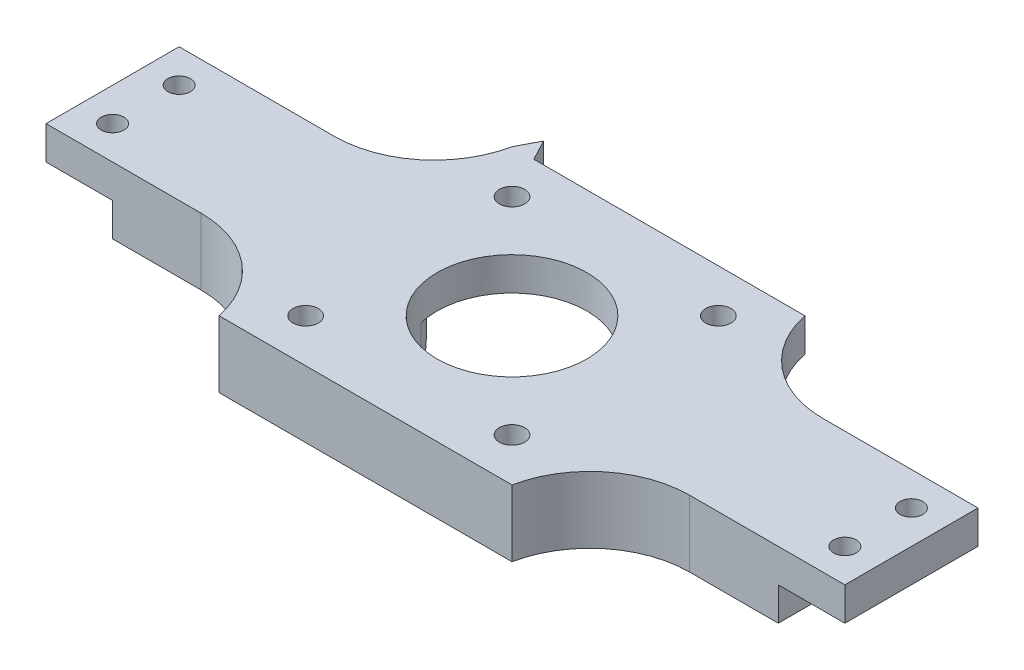
ISO-10303-21;
HEADER;
FILE_DESCRIPTION(('STEP AP214'),'2;1');
FILE_NAME('part.step','',(''),(''),'','','');
FILE_SCHEMA(('AUTOMOTIVE_DESIGN { 1 0 10303 214 1 1 1 1 }'));
ENDSEC;
DATA;
#1=APPLICATION_CONTEXT('core data for automotive mechanical design processes');
#2=APPLICATION_PROTOCOL_DEFINITION('international standard','automotive_design',2000,#1);
#3=PRODUCT_CONTEXT('',#1,'mechanical');
#4=PRODUCT('Part','Part','',(#3));
#5=PRODUCT_RELATED_PRODUCT_CATEGORY('part','',(#4));
#6=PRODUCT_DEFINITION_FORMATION('','',#4);
#7=PRODUCT_DEFINITION_CONTEXT('part definition',#1,'design');
#8=PRODUCT_DEFINITION('design','',#6,#7);
#9=PRODUCT_DEFINITION_SHAPE('','',#8);
#10=(LENGTH_UNIT() NAMED_UNIT(*) SI_UNIT(.MILLI.,.METRE.));
#11=(NAMED_UNIT(*) PLANE_ANGLE_UNIT() SI_UNIT($,.RADIAN.));
#12=(NAMED_UNIT(*) SI_UNIT($,.STERADIAN.) SOLID_ANGLE_UNIT());
#13=UNCERTAINTY_MEASURE_WITH_UNIT(LENGTH_MEASURE(1.E-05),#10,'distance_accuracy_value','');
#14=(GEOMETRIC_REPRESENTATION_CONTEXT(3) GLOBAL_UNCERTAINTY_ASSIGNED_CONTEXT((#13)) GLOBAL_UNIT_ASSIGNED_CONTEXT((#10,
#11,#12)) REPRESENTATION_CONTEXT('',''));
#15=CARTESIAN_POINT('',(0.,0.,0.));
#16=DIRECTION('',(0.,0.,1.));
#17=DIRECTION('',(1.,0.,0.));
#18=AXIS2_PLACEMENT_3D('',#15,#16,#17);
#19=CARTESIAN_POINT('',(22.,10.,4.8));
#20=DIRECTION('',(0.,0.,-1.));
#21=DIRECTION('',(-1.,0.,0.));
#22=AXIS2_PLACEMENT_3D('',#19,#20,#21);
#23=PLANE('',#22);
#24=DIRECTION('',(0.,1.,0.));
#25=VECTOR('',#24,1.);
#26=CARTESIAN_POINT('',(50.,10.,4.8));
#27=LINE('',#26,#25);
#28=CARTESIAN_POINT('',(50.,0.,4.8));
#29=VERTEX_POINT('',#28);
#30=CARTESIAN_POINT('',(50.,5.,4.8));
#31=VERTEX_POINT('',#30);
#32=EDGE_CURVE('E71',#29,#31,#27,.T.);
#33=ORIENTED_EDGE('',*,*,#32,.T.);
#34=DIRECTION('',(1.,0.,0.));
#35=VECTOR('',#34,1.);
#36=CARTESIAN_POINT('',(22.,5.,4.8));
#37=LINE('',#36,#35);
#38=CARTESIAN_POINT('',(60.,5.,4.8));
#39=VERTEX_POINT('',#38);
#40=EDGE_CURVE('E295',#31,#39,#37,.T.);
#41=ORIENTED_EDGE('',*,*,#40,.T.);
#42=DIRECTION('',(0.,-1.,0.));
#43=VECTOR('',#42,1.);
#44=CARTESIAN_POINT('',(60.,10.,4.8));
#45=LINE('',#44,#43);
#46=CARTESIAN_POINT('',(60.,10.,4.8));
#47=VERTEX_POINT('',#46);
#48=EDGE_CURVE('E445',#47,#39,#45,.T.);
#49=ORIENTED_EDGE('',*,*,#48,.F.);
#50=DIRECTION('',(1.,0.,0.));
#51=VECTOR('',#50,1.);
#52=CARTESIAN_POINT('',(22.,10.,4.8));
#53=LINE('',#52,#51);
#54=CARTESIAN_POINT('',(36.6969384566991,10.,4.8));
#55=VERTEX_POINT('',#54);
#56=EDGE_CURVE('E464',#55,#47,#53,.T.);
#57=ORIENTED_EDGE('',*,*,#56,.F.);
#58=DIRECTION('',(0.,-1.,0.));
#59=VECTOR('',#58,1.);
#60=CARTESIAN_POINT('',(36.6969384566991,10.,4.8));
#61=LINE('',#60,#59);
#62=CARTESIAN_POINT('',(36.6969384566991,0.,4.8));
#63=VERTEX_POINT('',#62);
#64=EDGE_CURVE('E491',#55,#63,#61,.T.);
#65=ORIENTED_EDGE('',*,*,#64,.T.);
#66=DIRECTION('',(1.,0.,0.));
#67=VECTOR('',#66,1.);
#68=CARTESIAN_POINT('',(22.,0.,4.8));
#69=LINE('',#68,#67);
#70=EDGE_CURVE('E451',#63,#29,#69,.T.);
#71=ORIENTED_EDGE('',*,*,#70,.T.);
#72=EDGE_LOOP('',(#33,#41,#49,#57,#65,#71));
#73=FACE_BOUND('',#72,.T.);
#74=ADVANCED_FACE('F44',(#73),#23,.F.);
#75=CARTESIAN_POINT('',(60.,10.,4.8));
#76=DIRECTION('',(-1.,0.,0.));
#77=DIRECTION('',(0.,0.,1.));
#78=AXIS2_PLACEMENT_3D('',#75,#76,#77);
#79=PLANE('',#78);
#80=ORIENTED_EDGE('',*,*,#48,.T.);
#81=DIRECTION('',(0.,0.,-1.));
#82=VECTOR('',#81,1.);
#83=CARTESIAN_POINT('',(60.,5.,16.8));
#84=LINE('',#83,#82);
#85=CARTESIAN_POINT('',(60.,5.,-15.2));
#86=VERTEX_POINT('',#85);
#87=EDGE_CURVE('E560',#39,#86,#84,.T.);
#88=ORIENTED_EDGE('',*,*,#87,.T.);
#89=DIRECTION('',(0.,-1.,0.));
#90=VECTOR('',#89,1.);
#91=CARTESIAN_POINT('',(60.,10.,-15.2));
#92=LINE('',#91,#90);
#93=CARTESIAN_POINT('',(60.,10.,-15.2));
#94=VERTEX_POINT('',#93);
#95=EDGE_CURVE('E482',#94,#86,#92,.T.);
#96=ORIENTED_EDGE('',*,*,#95,.F.);
#97=DIRECTION('',(0.,0.,-1.));
#98=VECTOR('',#97,1.);
#99=CARTESIAN_POINT('',(60.,10.,4.8));
#100=LINE('',#99,#98);
#101=EDGE_CURVE('E575',#47,#94,#100,.T.);
#102=ORIENTED_EDGE('',*,*,#101,.F.);
#103=EDGE_LOOP('',(#80,#88,#96,#102));
#104=FACE_BOUND('',#103,.T.);
#105=ADVANCED_FACE('F329',(#104),#79,.F.);
#106=CARTESIAN_POINT('',(60.,10.,-15.2));
#107=DIRECTION('',(0.,0.,1.));
#108=DIRECTION('',(1.,0.,0.));
#109=AXIS2_PLACEMENT_3D('',#106,#107,#108);
#110=PLANE('',#109);
#111=ORIENTED_EDGE('',*,*,#95,.T.);
#112=DIRECTION('',(-1.,0.,0.));
#113=VECTOR('',#112,1.);
#114=CARTESIAN_POINT('',(60.,5.,-15.2));
#115=LINE('',#114,#113);
#116=CARTESIAN_POINT('',(50.,5.,-15.2));
#117=VERTEX_POINT('',#116);
#118=EDGE_CURVE('E13',#86,#117,#115,.T.);
#119=ORIENTED_EDGE('',*,*,#118,.T.);
#120=DIRECTION('',(0.,-1.,0.));
#121=VECTOR('',#120,1.);
#122=CARTESIAN_POINT('',(50.,10.,-15.2));
#123=LINE('',#122,#121);
#124=CARTESIAN_POINT('',(50.,0.,-15.2));
#125=VERTEX_POINT('',#124);
#126=EDGE_CURVE('E563',#117,#125,#123,.T.);
#127=ORIENTED_EDGE('',*,*,#126,.T.);
#128=DIRECTION('',(-1.,0.,0.));
#129=VECTOR('',#128,1.);
#130=CARTESIAN_POINT('',(60.,0.,-15.2));
#131=LINE('',#130,#129);
#132=CARTESIAN_POINT('',(27.3690061931375,0.,-15.2));
#133=VERTEX_POINT('',#132);
#134=EDGE_CURVE('E448',#125,#133,#131,.T.);
#135=ORIENTED_EDGE('',*,*,#134,.T.);
#136=CARTESIAN_POINT('',(27.3690061931375,5.25,-15.2));
#137=CARTESIAN_POINT('',(27.3690061931375,3.41666666666667,-15.2));
#138=CARTESIAN_POINT('',(27.3690061931375,1.58333333333333,-15.2));
#139=CARTESIAN_POINT('',(27.3690061931375,-0.25,-15.2));
#140=(BOUNDED_CURVE() B_SPLINE_CURVE(3,(#136,#137,#138,#139),.UNSPECIFIED.,.F.,
.F.) B_SPLINE_CURVE_WITH_KNOTS((4,4),(-0.00025,0.00525),
.UNSPECIFIED.) CURVE() GEOMETRIC_REPRESENTATION_ITEM() RATIONAL_B_SPLINE_CURVE((1.,1.,1.,1.)) REPRESENTATION_ITEM(''));
#141=CARTESIAN_POINT('',(27.3690061931375,5.,-15.2));
#142=VERTEX_POINT('',#141);
#143=EDGE_CURVE('E313',#133,#142,#140,.F.);
#144=ORIENTED_EDGE('',*,*,#143,.T.);
#145=DIRECTION('',(-1.,0.,0.));
#146=VECTOR('',#145,1.);
#147=CARTESIAN_POINT('',(60.,5.,-15.2));
#148=LINE('',#147,#146);
#149=CARTESIAN_POINT('',(36.6969384566991,5.,-15.2));
#150=VERTEX_POINT('',#149);
#151=EDGE_CURVE('E294',#150,#142,#148,.T.);
#152=ORIENTED_EDGE('',*,*,#151,.F.);
#153=DIRECTION('',(0.,1.,0.));
#154=VECTOR('',#153,1.);
#155=CARTESIAN_POINT('',(36.6969384566991,10.,-15.2));
#156=LINE('',#155,#154);
#157=CARTESIAN_POINT('',(36.6969384566991,10.,-15.2));
#158=VERTEX_POINT('',#157);
#159=EDGE_CURVE('E494',#150,#158,#156,.T.);
#160=ORIENTED_EDGE('',*,*,#159,.T.);
#161=DIRECTION('',(-1.,0.,0.));
#162=VECTOR('',#161,1.);
#163=CARTESIAN_POINT('',(60.,10.,-15.2));
#164=LINE('',#163,#162);
#165=EDGE_CURVE('E577',#94,#158,#164,.T.);
#166=ORIENTED_EDGE('',*,*,#165,.F.);
#167=EDGE_LOOP('',(#111,#119,#127,#135,#144,#152,#160,#166));
#168=FACE_BOUND('',#167,.T.);
#169=ADVANCED_FACE('F319',(#168),#110,.F.);
#170=CARTESIAN_POINT('',(-22.,10.,-27.2));
#171=DIRECTION('',(0.,0.,1.));
#172=DIRECTION('',(1.,0.,0.));
#173=AXIS2_PLACEMENT_3D('',#170,#171,#172);
#174=PLANE('',#173);
#175=DIRECTION('',(-1.,0.,0.));
#176=VECTOR('',#175,1.);
#177=CARTESIAN_POINT('',(-22.,5.,-27.2));
#178=LINE('',#177,#176);
#179=CARTESIAN_POINT('',(22.,5.,-27.2));
#180=VERTEX_POINT('',#179);
#181=CARTESIAN_POINT('',(-18.7207327581259,5.,-27.2));
#182=VERTEX_POINT('',#181);
#183=EDGE_CURVE('E213',#180,#182,#178,.T.);
#184=ORIENTED_EDGE('',*,*,#183,.T.);
#185=DIRECTION('',(0.,1.,0.));
#186=VECTOR('',#185,1.);
#187=CARTESIAN_POINT('',(-18.7207327581259,5.,-27.2));
#188=LINE('',#187,#186);
#189=CARTESIAN_POINT('',(-18.7207327581259,10.,-27.2));
#190=VERTEX_POINT('',#189);
#191=EDGE_CURVE('E196',#182,#190,#188,.T.);
#192=ORIENTED_EDGE('',*,*,#191,.T.);
#193=DIRECTION('',(-1.,0.,0.));
#194=VECTOR('',#193,1.);
#195=CARTESIAN_POINT('',(0.,10.,-27.2));
#196=LINE('',#195,#194);
#197=CARTESIAN_POINT('',(22.,10.,-27.2));
#198=VERTEX_POINT('',#197);
#199=EDGE_CURVE('E579',#198,#190,#196,.T.);
#200=ORIENTED_EDGE('',*,*,#199,.F.);
#201=DIRECTION('',(0.,-1.,0.));
#202=VECTOR('',#201,1.);
#203=CARTESIAN_POINT('',(22.,10.,-27.2));
#204=LINE('',#203,#202);
#205=EDGE_CURVE('E220',#198,#180,#204,.T.);
#206=ORIENTED_EDGE('',*,*,#205,.T.);
#207=EDGE_LOOP('',(#184,#192,#200,#206));
#208=FACE_BOUND('',#207,.T.);
#209=ADVANCED_FACE('F218',(#208),#174,.F.);
#210=CARTESIAN_POINT('',(-22.,10.,-15.2));
#211=DIRECTION('',(0.,0.,1.));
#212=DIRECTION('',(1.,0.,0.));
#213=AXIS2_PLACEMENT_3D('',#210,#211,#212);
#214=PLANE('',#213);
#215=DIRECTION('',(-1.,0.,0.));
#216=VECTOR('',#215,1.);
#217=CARTESIAN_POINT('',(-22.,0.,-15.2));
#218=LINE('',#217,#216);
#219=CARTESIAN_POINT('',(-27.3690061931375,0.,-15.2));
#220=VERTEX_POINT('',#219);
#221=CARTESIAN_POINT('',(-50.,0.,-15.2));
#222=VERTEX_POINT('',#221);
#223=EDGE_CURVE('E296',#220,#222,#218,.T.);
#224=ORIENTED_EDGE('',*,*,#223,.T.);
#225=DIRECTION('',(0.,1.,0.));
#226=VECTOR('',#225,1.);
#227=CARTESIAN_POINT('',(-50.,10.,-15.2));
#228=LINE('',#227,#226);
#229=CARTESIAN_POINT('',(-50.,5.,-15.2));
#230=VERTEX_POINT('',#229);
#231=EDGE_CURVE('E559',#222,#230,#228,.T.);
#232=ORIENTED_EDGE('',*,*,#231,.T.);
#233=DIRECTION('',(-1.,0.,0.));
#234=VECTOR('',#233,1.);
#235=CARTESIAN_POINT('',(-22.,5.,-15.2));
#236=LINE('',#235,#234);
#237=CARTESIAN_POINT('',(-60.,5.,-15.2));
#238=VERTEX_POINT('',#237);
#239=EDGE_CURVE('E566',#230,#238,#236,.T.);
#240=ORIENTED_EDGE('',*,*,#239,.T.);
#241=DIRECTION('',(0.,-1.,0.));
#242=VECTOR('',#241,1.);
#243=CARTESIAN_POINT('',(-60.,10.,-15.2));
#244=LINE('',#243,#242);
#245=CARTESIAN_POINT('',(-60.,10.,-15.2));
#246=VERTEX_POINT('',#245);
#247=EDGE_CURVE('E475',#246,#238,#244,.T.);
#248=ORIENTED_EDGE('',*,*,#247,.F.);
#249=DIRECTION('',(-1.,0.,0.));
#250=VECTOR('',#249,1.);
#251=CARTESIAN_POINT('',(-22.,10.,-15.2));
#252=LINE('',#251,#250);
#253=CARTESIAN_POINT('',(-36.6969384566991,10.,-15.2));
#254=VERTEX_POINT('',#253);
#255=EDGE_CURVE('E584',#254,#246,#252,.T.);
#256=ORIENTED_EDGE('',*,*,#255,.F.);
#257=DIRECTION('',(0.,-1.,0.));
#258=VECTOR('',#257,1.);
#259=CARTESIAN_POINT('',(-36.6969384566991,10.,-15.2));
#260=LINE('',#259,#258);
#261=CARTESIAN_POINT('',(-36.6969384566991,5.,-15.2));
#262=VERTEX_POINT('',#261);
#263=EDGE_CURVE('E444',#254,#262,#260,.T.);
#264=ORIENTED_EDGE('',*,*,#263,.T.);
#265=CARTESIAN_POINT('',(-27.3690061931375,5.,-15.2));
#266=VERTEX_POINT('',#265);
#267=EDGE_CURVE('E286',#266,#262,#148,.T.);
#268=ORIENTED_EDGE('',*,*,#267,.F.);
#269=CARTESIAN_POINT('',(-27.3690061931375,-0.25,-15.2));
#270=CARTESIAN_POINT('',(-27.3690061931375,1.58333333333333,-15.2));
#271=CARTESIAN_POINT('',(-27.3690061931375,3.41666666666667,-15.2));
#272=CARTESIAN_POINT('',(-27.3690061931375,5.25,-15.2));
#273=(BOUNDED_CURVE() B_SPLINE_CURVE(3,(#269,#270,#271,#272),.UNSPECIFIED.,.F.,
.F.) B_SPLINE_CURVE_WITH_KNOTS((4,4),(-0.00025,0.00525),
.UNSPECIFIED.) CURVE() GEOMETRIC_REPRESENTATION_ITEM() RATIONAL_B_SPLINE_CURVE((1.,1.,1.,1.)) REPRESENTATION_ITEM(''));
#274=EDGE_CURVE('E391',#266,#220,#273,.F.);
#275=ORIENTED_EDGE('',*,*,#274,.T.);
#276=EDGE_LOOP('',(#224,#232,#240,#248,#256,#264,#268,#275));
#277=FACE_BOUND('',#276,.T.);
#278=ADVANCED_FACE('F629',(#277),#214,.F.);
#279=CARTESIAN_POINT('',(-60.,10.,4.8));
#280=DIRECTION('',(1.,0.,0.));
#281=DIRECTION('',(0.,0.,-1.));
#282=AXIS2_PLACEMENT_3D('',#279,#280,#281);
#283=PLANE('',#282);
#284=ORIENTED_EDGE('',*,*,#247,.T.);
#285=DIRECTION('',(0.,0.,-1.));
#286=VECTOR('',#285,1.);
#287=CARTESIAN_POINT('',(-60.,5.,16.8));
#288=LINE('',#287,#286);
#289=CARTESIAN_POINT('',(-60.,5.,4.8));
#290=VERTEX_POINT('',#289);
#291=EDGE_CURVE('E541',#290,#238,#288,.T.);
#292=ORIENTED_EDGE('',*,*,#291,.F.);
#293=DIRECTION('',(0.,-1.,0.));
#294=VECTOR('',#293,1.);
#295=CARTESIAN_POINT('',(-60.,10.,4.8));
#296=LINE('',#295,#294);
#297=CARTESIAN_POINT('',(-60.,10.,4.8));
#298=VERTEX_POINT('',#297);
#299=EDGE_CURVE('E472',#298,#290,#296,.T.);
#300=ORIENTED_EDGE('',*,*,#299,.F.);
#301=DIRECTION('',(0.,0.,1.));
#302=VECTOR('',#301,1.);
#303=CARTESIAN_POINT('',(-60.,10.,4.8));
#304=LINE('',#303,#302);
#305=EDGE_CURVE('E586',#246,#298,#304,.T.);
#306=ORIENTED_EDGE('',*,*,#305,.F.);
#307=EDGE_LOOP('',(#284,#292,#300,#306));
#308=FACE_BOUND('',#307,.T.);
#309=ADVANCED_FACE('F546',(#308),#283,.F.);
#310=CARTESIAN_POINT('',(-60.,10.,4.8));
#311=DIRECTION('',(0.,0.,-1.));
#312=DIRECTION('',(-1.,0.,0.));
#313=AXIS2_PLACEMENT_3D('',#310,#311,#312);
#314=PLANE('',#313);
#315=DIRECTION('',(1.,0.,0.));
#316=VECTOR('',#315,1.);
#317=CARTESIAN_POINT('',(-60.,5.,4.8));
#318=LINE('',#317,#316);
#319=CARTESIAN_POINT('',(-50.,5.,4.8));
#320=VERTEX_POINT('',#319);
#321=EDGE_CURVE('E56',#290,#320,#318,.T.);
#322=ORIENTED_EDGE('',*,*,#321,.T.);
#323=DIRECTION('',(0.,-1.,0.));
#324=VECTOR('',#323,1.);
#325=CARTESIAN_POINT('',(-50.,10.,4.8));
#326=LINE('',#325,#324);
#327=CARTESIAN_POINT('',(-50.,0.,4.8));
#328=VERTEX_POINT('',#327);
#329=EDGE_CURVE('E534',#320,#328,#326,.T.);
#330=ORIENTED_EDGE('',*,*,#329,.T.);
#331=DIRECTION('',(1.,0.,0.));
#332=VECTOR('',#331,1.);
#333=CARTESIAN_POINT('',(-60.,0.,4.8));
#334=LINE('',#333,#332);
#335=CARTESIAN_POINT('',(-36.6969384566991,0.,4.8));
#336=VERTEX_POINT('',#335);
#337=EDGE_CURVE('E459',#328,#336,#334,.T.);
#338=ORIENTED_EDGE('',*,*,#337,.T.);
#339=DIRECTION('',(0.,1.,0.));
#340=VECTOR('',#339,1.);
#341=CARTESIAN_POINT('',(-36.6969384566991,10.,4.8));
#342=LINE('',#341,#340);
#343=CARTESIAN_POINT('',(-36.6969384566991,10.,4.8));
#344=VERTEX_POINT('',#343);
#345=EDGE_CURVE('E489',#336,#344,#342,.T.);
#346=ORIENTED_EDGE('',*,*,#345,.T.);
#347=DIRECTION('',(1.,0.,0.));
#348=VECTOR('',#347,1.);
#349=CARTESIAN_POINT('',(-60.,10.,4.8));
#350=LINE('',#349,#348);
#351=EDGE_CURVE('E588',#298,#344,#350,.T.);
#352=ORIENTED_EDGE('',*,*,#351,.F.);
#353=ORIENTED_EDGE('',*,*,#299,.T.);
#354=EDGE_LOOP('',(#322,#330,#338,#346,#352,#353));
#355=FACE_BOUND('',#354,.T.);
#356=ADVANCED_FACE('F533',(#355),#314,.F.);
#357=CARTESIAN_POINT('',(-22.,10.,16.8));
#358=DIRECTION('',(0.,0.,-1.));
#359=DIRECTION('',(-1.,0.,0.));
#360=AXIS2_PLACEMENT_3D('',#357,#358,#359);
#361=PLANE('',#360);
#362=DIRECTION('',(1.,0.,0.));
#363=VECTOR('',#362,1.);
#364=CARTESIAN_POINT('',(-22.,0.,16.8));
#365=LINE('',#364,#363);
#366=CARTESIAN_POINT('',(-22.,0.,16.8));
#367=VERTEX_POINT('',#366);
#368=CARTESIAN_POINT('',(22.,0.,16.8));
#369=VERTEX_POINT('',#368);
#370=EDGE_CURVE('E461',#367,#369,#365,.T.);
#371=ORIENTED_EDGE('',*,*,#370,.T.);
#372=DIRECTION('',(0.,-1.,0.));
#373=VECTOR('',#372,1.);
#374=CARTESIAN_POINT('',(22.,10.,16.8));
#375=LINE('',#374,#373);
#376=CARTESIAN_POINT('',(22.,10.,16.8));
#377=VERTEX_POINT('',#376);
#378=EDGE_CURVE('E465',#377,#369,#375,.T.);
#379=ORIENTED_EDGE('',*,*,#378,.F.);
#380=DIRECTION('',(1.,0.,0.));
#381=VECTOR('',#380,1.);
#382=CARTESIAN_POINT('',(-22.,10.,16.8));
#383=LINE('',#382,#381);
#384=CARTESIAN_POINT('',(-22.,10.,16.8));
#385=VERTEX_POINT('',#384);
#386=EDGE_CURVE('E469',#385,#377,#383,.T.);
#387=ORIENTED_EDGE('',*,*,#386,.F.);
#388=DIRECTION('',(0.,-1.,0.));
#389=VECTOR('',#388,1.);
#390=CARTESIAN_POINT('',(-22.,10.,16.8));
#391=LINE('',#390,#389);
#392=EDGE_CURVE('E468',#385,#367,#391,.T.);
#393=ORIENTED_EDGE('',*,*,#392,.T.);
#394=EDGE_LOOP('',(#371,#379,#387,#393));
#395=FACE_BOUND('',#394,.T.);
#396=ADVANCED_FACE('F597',(#395),#361,.F.);
#397=CARTESIAN_POINT('',(0.,10.,0.));
#398=DIRECTION('',(0.,1.,0.));
#399=DIRECTION('',(0.,0.,1.));
#400=AXIS2_PLACEMENT_3D('',#397,#398,#399);
#401=PLANE('',#400);
#402=CARTESIAN_POINT('',(55.,10.,-0.200000000000001));
#403=DIRECTION('',(0.,1.,0.));
#404=DIRECTION('',(0.,0.,1.));
#405=AXIS2_PLACEMENT_3D('',#402,#403,#404);
#406=CIRCLE('',#405,1.7);
#407=CARTESIAN_POINT('',(55.,10.,1.5));
#408=VERTEX_POINT('',#407);
#409=EDGE_CURVE('E937',#408,#408,#406,.T.);
#410=ORIENTED_EDGE('',*,*,#409,.F.);
#411=EDGE_LOOP('',(#410));
#412=FACE_BOUND('',#411,.T.);
#413=CARTESIAN_POINT('',(55.,10.,-10.2));
#414=DIRECTION('',(0.,1.,0.));
#415=DIRECTION('',(0.,0.,1.));
#416=AXIS2_PLACEMENT_3D('',#413,#414,#415);
#417=CIRCLE('',#416,1.7);
#418=CARTESIAN_POINT('',(55.,10.,-8.5));
#419=VERTEX_POINT('',#418);
#420=EDGE_CURVE('E934',#419,#419,#417,.T.);
#421=ORIENTED_EDGE('',*,*,#420,.F.);
#422=EDGE_LOOP('',(#421));
#423=FACE_BOUND('',#422,.T.);
#424=CARTESIAN_POINT('',(-55.,10.,-10.2));
#425=DIRECTION('',(0.,1.,0.));
#426=DIRECTION('',(0.,0.,1.));
#427=AXIS2_PLACEMENT_3D('',#424,#425,#426);
#428=CIRCLE('',#427,1.7);
#429=CARTESIAN_POINT('',(-55.,10.,-8.5));
#430=VERTEX_POINT('',#429);
#431=EDGE_CURVE('E549',#430,#430,#428,.T.);
#432=ORIENTED_EDGE('',*,*,#431,.F.);
#433=EDGE_LOOP('',(#432));
#434=FACE_BOUND('',#433,.T.);
#435=CARTESIAN_POINT('',(-55.,10.,-0.200000000000001));
#436=DIRECTION('',(0.,1.,0.));
#437=DIRECTION('',(0.,0.,1.));
#438=AXIS2_PLACEMENT_3D('',#435,#436,#437);
#439=CIRCLE('',#438,1.7);
#440=CARTESIAN_POINT('',(-55.,10.,1.5));
#441=VERTEX_POINT('',#440);
#442=EDGE_CURVE('E554',#441,#441,#439,.T.);
#443=ORIENTED_EDGE('',*,*,#442,.F.);
#444=EDGE_LOOP('',(#443));
#445=FACE_BOUND('',#444,.T.);
#446=CARTESIAN_POINT('',(0.,10.,-5.2));
#447=DIRECTION('',(0.,1.,0.));
#448=DIRECTION('',(0.,0.,1.));
#449=AXIS2_PLACEMENT_3D('',#446,#447,#448);
#450=CIRCLE('',#449,11.25);
#451=CARTESIAN_POINT('',(0.,10.,6.05));
#452=VERTEX_POINT('',#451);
#453=EDGE_CURVE('E221',#452,#452,#450,.T.);
#454=ORIENTED_EDGE('',*,*,#453,.F.);
#455=EDGE_LOOP('',(#454));
#456=FACE_BOUND('',#455,.T.);
#457=CARTESIAN_POINT('',(-15.5,10.,-20.7));
#458=DIRECTION('',(0.,1.,0.));
#459=DIRECTION('',(0.,0.,1.));
#460=AXIS2_PLACEMENT_3D('',#457,#458,#459);
#461=CIRCLE('',#460,1.9);
#462=CARTESIAN_POINT('',(-15.5,10.,-18.8));
#463=VERTEX_POINT('',#462);
#464=EDGE_CURVE('E245',#463,#463,#461,.T.);
#465=ORIENTED_EDGE('',*,*,#464,.F.);
#466=EDGE_LOOP('',(#465));
#467=FACE_BOUND('',#466,.T.);
#468=CARTESIAN_POINT('',(-15.5,10.,10.3));
#469=DIRECTION('',(0.,1.,0.));
#470=DIRECTION('',(0.,0.,1.));
#471=AXIS2_PLACEMENT_3D('',#468,#469,#470);
#472=CIRCLE('',#471,1.9);
#473=CARTESIAN_POINT('',(-15.5,10.,12.2));
#474=VERTEX_POINT('',#473);
#475=EDGE_CURVE('E242',#474,#474,#472,.T.);
#476=ORIENTED_EDGE('',*,*,#475,.F.);
#477=EDGE_LOOP('',(#476));
#478=FACE_BOUND('',#477,.T.);
#479=CARTESIAN_POINT('',(15.5,10.,10.3));
#480=DIRECTION('',(0.,1.,0.));
#481=DIRECTION('',(0.,0.,1.));
#482=AXIS2_PLACEMENT_3D('',#479,#480,#481);
#483=CIRCLE('',#482,1.9);
#484=CARTESIAN_POINT('',(15.5,10.,12.2));
#485=VERTEX_POINT('',#484);
#486=EDGE_CURVE('E236',#485,#485,#483,.T.);
#487=ORIENTED_EDGE('',*,*,#486,.F.);
#488=EDGE_LOOP('',(#487));
#489=FACE_BOUND('',#488,.T.);
#490=CARTESIAN_POINT('',(15.5,10.,-20.7));
#491=DIRECTION('',(0.,1.,0.));
#492=DIRECTION('',(0.,0.,1.));
#493=AXIS2_PLACEMENT_3D('',#490,#491,#492);
#494=CIRCLE('',#493,1.9);
#495=CARTESIAN_POINT('',(15.5,10.,-18.8));
#496=VERTEX_POINT('',#495);
#497=EDGE_CURVE('E235',#496,#496,#494,.T.);
#498=ORIENTED_EDGE('',*,*,#497,.F.);
#499=EDGE_LOOP('',(#498));
#500=FACE_BOUND('',#499,.T.);
#501=ORIENTED_EDGE('',*,*,#386,.T.);
#502=CARTESIAN_POINT('',(36.6969384566991,10.,19.8));
#503=DIRECTION('',(0.,1.,0.));
#504=DIRECTION('',(0.,0.,1.));
#505=AXIS2_PLACEMENT_3D('',#502,#503,#504);
#506=CIRCLE('',#505,15.);
#507=EDGE_CURVE('E507',#377,#55,#506,.F.);
#508=ORIENTED_EDGE('',*,*,#507,.T.);
#509=ORIENTED_EDGE('',*,*,#56,.T.);
#510=ORIENTED_EDGE('',*,*,#101,.T.);
#511=ORIENTED_EDGE('',*,*,#165,.T.);
#512=CARTESIAN_POINT('',(36.6969384566991,10.,-30.2));
#513=DIRECTION('',(0.,1.,0.));
#514=DIRECTION('',(0.,0.,1.));
#515=AXIS2_PLACEMENT_3D('',#512,#513,#514);
#516=CIRCLE('',#515,15.);
#517=EDGE_CURVE('E254',#158,#198,#516,.F.);
#518=ORIENTED_EDGE('',*,*,#517,.T.);
#519=ORIENTED_EDGE('',*,*,#199,.T.);
#520=DIRECTION('',(-0.466702684713203,0.,-0.884414271753621));
#521=VECTOR('',#520,1.);
#522=CARTESIAN_POINT('',(-18.7207327581259,10.,-27.2));
#523=LINE('',#522,#521);
#524=CARTESIAN_POINT('',(-20.3603663790629,10.,-30.3071502742585));
#525=VERTEX_POINT('',#524);
#526=EDGE_CURVE('E63',#190,#525,#523,.T.);
#527=ORIENTED_EDGE('',*,*,#526,.T.);
#528=DIRECTION('',(-0.466702684713203,0.,0.884414271753621));
#529=VECTOR('',#528,1.);
#530=CARTESIAN_POINT('',(-22.,10.,-27.2));
#531=LINE('',#530,#529);
#532=CARTESIAN_POINT('',(-22.,10.,-27.2));
#533=VERTEX_POINT('',#532);
#534=EDGE_CURVE('E216',#525,#533,#531,.T.);
#535=ORIENTED_EDGE('',*,*,#534,.T.);
#536=CARTESIAN_POINT('',(-36.6969384566991,10.,-30.2));
#537=DIRECTION('',(0.,1.,0.));
#538=DIRECTION('',(0.,0.,1.));
#539=AXIS2_PLACEMENT_3D('',#536,#537,#538);
#540=CIRCLE('',#539,15.);
#541=EDGE_CURVE('E498',#533,#254,#540,.F.);
#542=ORIENTED_EDGE('',*,*,#541,.T.);
#543=ORIENTED_EDGE('',*,*,#255,.T.);
#544=ORIENTED_EDGE('',*,*,#305,.T.);
#545=ORIENTED_EDGE('',*,*,#351,.T.);
#546=CARTESIAN_POINT('',(-36.6969384566991,10.,19.8));
#547=DIRECTION('',(0.,1.,0.));
#548=DIRECTION('',(0.,0.,1.));
#549=AXIS2_PLACEMENT_3D('',#546,#547,#548);
#550=CIRCLE('',#549,15.);
#551=EDGE_CURVE('E503',#344,#385,#550,.F.);
#552=ORIENTED_EDGE('',*,*,#551,.T.);
#553=EDGE_LOOP('',(#501,#508,#509,#510,#511,#518,#519,#527,#535,#542,#543,#544,#545,#552));
#554=FACE_BOUND('',#553,.T.);
#555=ADVANCED_FACE('F592',(#412,#423,#434,#445,#456,#467,#478,#489,#500,#554),#401,.T.);
#556=CARTESIAN_POINT('',(0.,0.,0.));
#557=DIRECTION('',(0.,1.,0.));
#558=DIRECTION('',(0.,0.,1.));
#559=AXIS2_PLACEMENT_3D('',#556,#557,#558);
#560=PLANE('',#559);
#561=ORIENTED_EDGE('',*,*,#134,.F.);
#562=DIRECTION('',(0.,0.,1.));
#563=VECTOR('',#562,1.);
#564=CARTESIAN_POINT('',(50.,0.,0.));
#565=LINE('',#564,#563);
#566=EDGE_CURVE('E526',#125,#29,#565,.T.);
#567=ORIENTED_EDGE('',*,*,#566,.T.);
#568=ORIENTED_EDGE('',*,*,#70,.F.);
#569=CARTESIAN_POINT('',(36.6969384566991,0.,19.8));
#570=DIRECTION('',(0.,1.,0.));
#571=DIRECTION('',(0.,0.,1.));
#572=AXIS2_PLACEMENT_3D('',#569,#570,#571);
#573=CIRCLE('',#572,15.);
#574=EDGE_CURVE('E505',#63,#369,#573,.T.);
#575=ORIENTED_EDGE('',*,*,#574,.T.);
#576=ORIENTED_EDGE('',*,*,#370,.F.);
#577=CARTESIAN_POINT('',(-36.6969384566991,0.,19.8));
#578=DIRECTION('',(0.,1.,0.));
#579=DIRECTION('',(0.,0.,1.));
#580=AXIS2_PLACEMENT_3D('',#577,#578,#579);
#581=CIRCLE('',#580,15.);
#582=EDGE_CURVE('E500',#367,#336,#581,.T.);
#583=ORIENTED_EDGE('',*,*,#582,.T.);
#584=ORIENTED_EDGE('',*,*,#337,.F.);
#585=DIRECTION('',(0.,0.,-1.));
#586=VECTOR('',#585,1.);
#587=CARTESIAN_POINT('',(-50.,0.,0.));
#588=LINE('',#587,#586);
#589=EDGE_CURVE('E452',#328,#222,#588,.T.);
#590=ORIENTED_EDGE('',*,*,#589,.T.);
#591=ORIENTED_EDGE('',*,*,#223,.F.);
#592=CARTESIAN_POINT('',(-10.8991617583291,0.,-2.41238938053097));
#593=CARTESIAN_POINT('',(-14.169769163823,0.,-15.2));
#594=CARTESIAN_POINT('',(-27.3690061931375,0.,-15.2));
#595=(BOUNDED_CURVE() B_SPLINE_CURVE(2,(#592,#593,#594),.UNSPECIFIED.,.F.,
.F.) B_SPLINE_CURVE_WITH_KNOTS((3,3),(0.,1.),
.UNSPECIFIED.) CURVE() GEOMETRIC_REPRESENTATION_ITEM() RATIONAL_B_SPLINE_CURVE((1.,
0.223796354437661,1.)) REPRESENTATION_ITEM(''));
#596=CARTESIAN_POINT('',(-10.8991617583291,0.,-2.41238938053097));
#597=VERTEX_POINT('',#596);
#598=EDGE_CURVE('E519',#220,#597,#595,.F.);
#599=ORIENTED_EDGE('',*,*,#598,.T.);
#600=CARTESIAN_POINT('',(0.,0.,-5.2));
#601=DIRECTION('',(0.,1.,0.));
#602=DIRECTION('',(0.,0.,1.));
#603=AXIS2_PLACEMENT_3D('',#600,#601,#602);
#604=CIRCLE('',#603,11.25);
#605=CARTESIAN_POINT('',(10.8991617583291,0.,-2.41238938053097));
#606=VERTEX_POINT('',#605);
#607=EDGE_CURVE('E225',#597,#606,#604,.T.);
#608=ORIENTED_EDGE('',*,*,#607,.T.);
#609=CARTESIAN_POINT('',(27.3690061931375,0.,-15.2));
#610=CARTESIAN_POINT('',(14.169769163823,0.,-15.2));
#611=CARTESIAN_POINT('',(10.8991617583291,0.,-2.41238938053097));
#612=(BOUNDED_CURVE() B_SPLINE_CURVE(2,(#609,#610,#611),.UNSPECIFIED.,.F.,
.F.) B_SPLINE_CURVE_WITH_KNOTS((3,3),(0.,1.),
.UNSPECIFIED.) CURVE() GEOMETRIC_REPRESENTATION_ITEM() RATIONAL_B_SPLINE_CURVE((1.,
0.223796354437661,1.)) REPRESENTATION_ITEM(''));
#613=EDGE_CURVE('E403',#606,#133,#612,.F.);
#614=ORIENTED_EDGE('',*,*,#613,.T.);
#615=EDGE_LOOP('',(#561,#567,#568,#575,#576,#583,#584,#590,#591,#599,#608,#614));
#616=FACE_BOUND('',#615,.T.);
#617=CARTESIAN_POINT('',(-15.5,0.,10.3));
#618=DIRECTION('',(0.,1.,0.));
#619=DIRECTION('',(0.,0.,1.));
#620=AXIS2_PLACEMENT_3D('',#617,#618,#619);
#621=CIRCLE('',#620,1.9);
#622=CARTESIAN_POINT('',(-15.5,0.,12.2));
#623=VERTEX_POINT('',#622);
#624=EDGE_CURVE('E239',#623,#623,#621,.T.);
#625=ORIENTED_EDGE('',*,*,#624,.T.);
#626=EDGE_LOOP('',(#625));
#627=FACE_BOUND('',#626,.T.);
#628=CARTESIAN_POINT('',(15.5,0.,10.3));
#629=DIRECTION('',(0.,1.,0.));
#630=DIRECTION('',(0.,0.,1.));
#631=AXIS2_PLACEMENT_3D('',#628,#629,#630);
#632=CIRCLE('',#631,1.9);
#633=CARTESIAN_POINT('',(15.5,0.,12.2));
#634=VERTEX_POINT('',#633);
#635=EDGE_CURVE('E232',#634,#634,#632,.T.);
#636=ORIENTED_EDGE('',*,*,#635,.T.);
#637=EDGE_LOOP('',(#636));
#638=FACE_BOUND('',#637,.T.);
#639=ADVANCED_FACE('F600',(#616,#627,#638),#560,.F.);
#640=CARTESIAN_POINT('',(15.5,0.,-20.7));
#641=DIRECTION('',(0.,1.,0.));
#642=DIRECTION('',(0.,0.,1.));
#643=AXIS2_PLACEMENT_3D('',#640,#641,#642);
#644=CYLINDRICAL_SURFACE('',#643,1.9);
#645=CARTESIAN_POINT('',(15.5,5.,-20.7));
#646=DIRECTION('',(0.,1.,0.));
#647=DIRECTION('',(0.,0.,1.));
#648=AXIS2_PLACEMENT_3D('',#645,#646,#647);
#649=CIRCLE('',#648,1.9);
#650=CARTESIAN_POINT('',(15.5,5.,-18.8));
#651=VERTEX_POINT('',#650);
#652=EDGE_CURVE('E222',#651,#651,#649,.F.);
#653=ORIENTED_EDGE('',*,*,#652,.T.);
#654=EDGE_LOOP('',(#653));
#655=FACE_BOUND('',#654,.T.);
#656=ORIENTED_EDGE('',*,*,#497,.T.);
#657=EDGE_LOOP('',(#656));
#658=FACE_BOUND('',#657,.T.);
#659=ADVANCED_FACE('F280',(#655,#658),#644,.F.);
#660=CARTESIAN_POINT('',(15.5,0.,10.3));
#661=DIRECTION('',(0.,1.,0.));
#662=DIRECTION('',(0.,0.,1.));
#663=AXIS2_PLACEMENT_3D('',#660,#661,#662);
#664=CYLINDRICAL_SURFACE('',#663,1.9);
#665=ORIENTED_EDGE('',*,*,#635,.F.);
#666=EDGE_LOOP('',(#665));
#667=FACE_BOUND('',#666,.T.);
#668=ORIENTED_EDGE('',*,*,#486,.T.);
#669=EDGE_LOOP('',(#668));
#670=FACE_BOUND('',#669,.T.);
#671=ADVANCED_FACE('F815',(#667,#670),#664,.F.);
#672=CARTESIAN_POINT('',(-15.5,0.,10.3));
#673=DIRECTION('',(0.,1.,0.));
#674=DIRECTION('',(0.,0.,1.));
#675=AXIS2_PLACEMENT_3D('',#672,#673,#674);
#676=CYLINDRICAL_SURFACE('',#675,1.9);
#677=ORIENTED_EDGE('',*,*,#624,.F.);
#678=EDGE_LOOP('',(#677));
#679=FACE_BOUND('',#678,.T.);
#680=ORIENTED_EDGE('',*,*,#475,.T.);
#681=EDGE_LOOP('',(#680));
#682=FACE_BOUND('',#681,.T.);
#683=ADVANCED_FACE('F833',(#679,#682),#676,.F.);
#684=CARTESIAN_POINT('',(-15.5,0.,-20.7));
#685=DIRECTION('',(0.,1.,0.));
#686=DIRECTION('',(0.,0.,1.));
#687=AXIS2_PLACEMENT_3D('',#684,#685,#686);
#688=CYLINDRICAL_SURFACE('',#687,1.9);
#689=CARTESIAN_POINT('',(-15.5,5.,-20.7));
#690=DIRECTION('',(0.,1.,0.));
#691=DIRECTION('',(0.,0.,1.));
#692=AXIS2_PLACEMENT_3D('',#689,#690,#691);
#693=CIRCLE('',#692,1.9);
#694=CARTESIAN_POINT('',(-15.5,5.,-18.8));
#695=VERTEX_POINT('',#694);
#696=EDGE_CURVE('E228',#695,#695,#693,.F.);
#697=ORIENTED_EDGE('',*,*,#696,.T.);
#698=EDGE_LOOP('',(#697));
#699=FACE_BOUND('',#698,.T.);
#700=ORIENTED_EDGE('',*,*,#464,.T.);
#701=EDGE_LOOP('',(#700));
#702=FACE_BOUND('',#701,.T.);
#703=ADVANCED_FACE('F278',(#699,#702),#688,.F.);
#704=CARTESIAN_POINT('',(0.,0.,-5.2));
#705=DIRECTION('',(0.,1.,0.));
#706=DIRECTION('',(0.,0.,1.));
#707=AXIS2_PLACEMENT_3D('',#704,#705,#706);
#708=CYLINDRICAL_SURFACE('',#707,11.25);
#709=ORIENTED_EDGE('',*,*,#607,.F.);
#710=CARTESIAN_POINT('',(-10.8991617583291,5.25,-2.41238938053097));
#711=CARTESIAN_POINT('',(-10.8991617583291,3.41666666666667,-2.41238938053097));
#712=CARTESIAN_POINT('',(-10.8991617583291,1.58333333333333,-2.41238938053097));
#713=CARTESIAN_POINT('',(-10.8991617583291,-0.25,-2.41238938053097));
#714=(BOUNDED_CURVE() B_SPLINE_CURVE(3,(#710,#711,#712,#713),.UNSPECIFIED.,.F.,
.F.) B_SPLINE_CURVE_WITH_KNOTS((4,4),(-0.00025,0.00525),
.UNSPECIFIED.) CURVE() GEOMETRIC_REPRESENTATION_ITEM() RATIONAL_B_SPLINE_CURVE((1.,1.,1.,1.)) REPRESENTATION_ITEM(''));
#715=CARTESIAN_POINT('',(-10.8991617583291,5.,-2.41238938053097));
#716=VERTEX_POINT('',#715);
#717=EDGE_CURVE('E513',#597,#716,#714,.F.);
#718=ORIENTED_EDGE('',*,*,#717,.T.);
#719=CARTESIAN_POINT('',(0.,5.,-5.2));
#720=DIRECTION('',(0.,1.,0.));
#721=DIRECTION('',(0.,0.,1.));
#722=AXIS2_PLACEMENT_3D('',#719,#720,#721);
#723=CIRCLE('',#722,11.25);
#724=CARTESIAN_POINT('',(10.8991617583291,5.,-2.41238938053097));
#725=VERTEX_POINT('',#724);
#726=EDGE_CURVE('E437',#716,#725,#723,.F.);
#727=ORIENTED_EDGE('',*,*,#726,.T.);
#728=CARTESIAN_POINT('',(10.8991617583291,-0.25,-2.41238938053097));
#729=CARTESIAN_POINT('',(10.8991617583291,1.58333333333333,-2.41238938053097));
#730=CARTESIAN_POINT('',(10.8991617583291,3.41666666666667,-2.41238938053097));
#731=CARTESIAN_POINT('',(10.8991617583291,5.25,-2.41238938053097));
#732=(BOUNDED_CURVE() B_SPLINE_CURVE(3,(#728,#729,#730,#731),.UNSPECIFIED.,.F.,
.F.) B_SPLINE_CURVE_WITH_KNOTS((4,4),(-0.00025,0.00525),
.UNSPECIFIED.) CURVE() GEOMETRIC_REPRESENTATION_ITEM() RATIONAL_B_SPLINE_CURVE((1.,1.,1.,1.)) REPRESENTATION_ITEM(''));
#733=EDGE_CURVE('E261',#725,#606,#732,.F.);
#734=ORIENTED_EDGE('',*,*,#733,.T.);
#735=EDGE_LOOP('',(#709,#718,#727,#734));
#736=FACE_BOUND('',#735,.T.);
#737=ORIENTED_EDGE('',*,*,#453,.T.);
#738=EDGE_LOOP('',(#737));
#739=FACE_BOUND('',#738,.T.);
#740=ADVANCED_FACE('F268',(#736,#739),#708,.F.);
#741=CARTESIAN_POINT('',(60.,5.,-36.0808213793679));
#742=DIRECTION('',(0.,1.,0.));
#743=DIRECTION('',(0.,0.,1.));
#744=AXIS2_PLACEMENT_3D('',#741,#742,#743);
#745=PLANE('',#744);
#746=ORIENTED_EDGE('',*,*,#696,.F.);
#747=EDGE_LOOP('',(#746));
#748=FACE_BOUND('',#747,.T.);
#749=ORIENTED_EDGE('',*,*,#652,.F.);
#750=EDGE_LOOP('',(#749));
#751=FACE_BOUND('',#750,.T.);
#752=ORIENTED_EDGE('',*,*,#151,.T.);
#753=CARTESIAN_POINT('',(10.8991617583291,5.,-2.41238938053097));
#754=CARTESIAN_POINT('',(14.169769163823,5.,-15.2));
#755=CARTESIAN_POINT('',(27.3690061931375,5.,-15.2));
#756=(BOUNDED_CURVE() B_SPLINE_CURVE(2,(#753,#754,#755),.UNSPECIFIED.,.F.,
.F.) B_SPLINE_CURVE_WITH_KNOTS((3,3),(0.,1.),
.UNSPECIFIED.) CURVE() GEOMETRIC_REPRESENTATION_ITEM() RATIONAL_B_SPLINE_CURVE((1.,
0.223796354437661,1.)) REPRESENTATION_ITEM(''));
#757=EDGE_CURVE('E424',#142,#725,#756,.F.);
#758=ORIENTED_EDGE('',*,*,#757,.T.);
#759=ORIENTED_EDGE('',*,*,#726,.F.);
#760=CARTESIAN_POINT('',(-27.3690061931375,5.,-15.2));
#761=CARTESIAN_POINT('',(-14.169769163823,5.,-15.2));
#762=CARTESIAN_POINT('',(-10.8991617583291,5.,-2.41238938053097));
#763=(BOUNDED_CURVE() B_SPLINE_CURVE(2,(#760,#761,#762),.UNSPECIFIED.,.F.,
.F.) B_SPLINE_CURVE_WITH_KNOTS((3,3),(0.,1.),
.UNSPECIFIED.) CURVE() GEOMETRIC_REPRESENTATION_ITEM() RATIONAL_B_SPLINE_CURVE((1.,
0.223796354437661,1.)) REPRESENTATION_ITEM(''));
#764=EDGE_CURVE('E523',#716,#266,#763,.F.);
#765=ORIENTED_EDGE('',*,*,#764,.T.);
#766=ORIENTED_EDGE('',*,*,#267,.T.);
#767=CARTESIAN_POINT('',(-36.6969384566991,5.,-30.2));
#768=DIRECTION('',(0.,1.,0.));
#769=DIRECTION('',(0.,0.,1.));
#770=AXIS2_PLACEMENT_3D('',#767,#768,#769);
#771=CIRCLE('',#770,15.);
#772=CARTESIAN_POINT('',(-22.,5.,-27.2));
#773=VERTEX_POINT('',#772);
#774=EDGE_CURVE('E496',#262,#773,#771,.T.);
#775=ORIENTED_EDGE('',*,*,#774,.T.);
#776=DIRECTION('',(-0.466702684713203,0.,0.884414271753621));
#777=VECTOR('',#776,1.);
#778=CARTESIAN_POINT('',(-22.,5.,-27.2));
#779=LINE('',#778,#777);
#780=CARTESIAN_POINT('',(-20.3603663790629,5.,-30.3071502742585));
#781=VERTEX_POINT('',#780);
#782=EDGE_CURVE('E206',#781,#773,#779,.T.);
#783=ORIENTED_EDGE('',*,*,#782,.F.);
#784=DIRECTION('',(-0.466702684713203,0.,-0.884414271753621));
#785=VECTOR('',#784,1.);
#786=CARTESIAN_POINT('',(-18.7207327581259,5.,-27.2));
#787=LINE('',#786,#785);
#788=EDGE_CURVE('E199',#182,#781,#787,.T.);
#789=ORIENTED_EDGE('',*,*,#788,.F.);
#790=ORIENTED_EDGE('',*,*,#183,.F.);
#791=CARTESIAN_POINT('',(36.6969384566991,5.,-30.2));
#792=DIRECTION('',(0.,1.,0.));
#793=DIRECTION('',(0.,0.,1.));
#794=AXIS2_PLACEMENT_3D('',#791,#792,#793);
#795=CIRCLE('',#794,15.);
#796=EDGE_CURVE('E508',#180,#150,#795,.T.);
#797=ORIENTED_EDGE('',*,*,#796,.T.);
#798=EDGE_LOOP('',(#752,#758,#759,#765,#766,#775,#783,#789,#790,#797));
#799=FACE_BOUND('',#798,.T.);
#800=ADVANCED_FACE('F211',(#748,#751,#799),#745,.F.);
#801=CARTESIAN_POINT('',(-36.6969384566991,10.,-30.2));
#802=DIRECTION('',(0.,-1.,0.));
#803=DIRECTION('',(0.,0.,-1.));
#804=AXIS2_PLACEMENT_3D('',#801,#802,#803);
#805=CYLINDRICAL_SURFACE('',#804,15.);
#806=ORIENTED_EDGE('',*,*,#541,.F.);
#807=DIRECTION('',(0.,-1.,0.));
#808=VECTOR('',#807,1.);
#809=CARTESIAN_POINT('',(-22.,10.,-27.2));
#810=LINE('',#809,#808);
#811=EDGE_CURVE('E478',#533,#773,#810,.T.);
#812=ORIENTED_EDGE('',*,*,#811,.T.);
#813=ORIENTED_EDGE('',*,*,#774,.F.);
#814=ORIENTED_EDGE('',*,*,#263,.F.);
#815=EDGE_LOOP('',(#806,#812,#813,#814));
#816=FACE_BOUND('',#815,.T.);
#817=ADVANCED_FACE('F337',(#816),#805,.F.);
#818=CARTESIAN_POINT('',(-36.6969384566991,10.,19.8));
#819=DIRECTION('',(0.,1.,0.));
#820=DIRECTION('',(0.,0.,1.));
#821=AXIS2_PLACEMENT_3D('',#818,#819,#820);
#822=CYLINDRICAL_SURFACE('',#821,15.);
#823=ORIENTED_EDGE('',*,*,#551,.F.);
#824=ORIENTED_EDGE('',*,*,#345,.F.);
#825=ORIENTED_EDGE('',*,*,#582,.F.);
#826=ORIENTED_EDGE('',*,*,#392,.F.);
#827=EDGE_LOOP('',(#823,#824,#825,#826));
#828=FACE_BOUND('',#827,.T.);
#829=ADVANCED_FACE('F340',(#828),#822,.F.);
#830=CARTESIAN_POINT('',(36.6969384566991,10.,19.8));
#831=DIRECTION('',(0.,-1.,0.));
#832=DIRECTION('',(0.,0.,-1.));
#833=AXIS2_PLACEMENT_3D('',#830,#831,#832);
#834=CYLINDRICAL_SURFACE('',#833,15.);
#835=ORIENTED_EDGE('',*,*,#507,.F.);
#836=ORIENTED_EDGE('',*,*,#378,.T.);
#837=ORIENTED_EDGE('',*,*,#574,.F.);
#838=ORIENTED_EDGE('',*,*,#64,.F.);
#839=EDGE_LOOP('',(#835,#836,#837,#838));
#840=FACE_BOUND('',#839,.T.);
#841=ADVANCED_FACE('F344',(#840),#834,.F.);
#842=CARTESIAN_POINT('',(36.6969384566991,10.,-30.2));
#843=DIRECTION('',(0.,1.,0.));
#844=DIRECTION('',(0.,0.,1.));
#845=AXIS2_PLACEMENT_3D('',#842,#843,#844);
#846=CYLINDRICAL_SURFACE('',#845,15.);
#847=ORIENTED_EDGE('',*,*,#517,.F.);
#848=ORIENTED_EDGE('',*,*,#159,.F.);
#849=ORIENTED_EDGE('',*,*,#796,.F.);
#850=ORIENTED_EDGE('',*,*,#205,.F.);
#851=EDGE_LOOP('',(#847,#848,#849,#850));
#852=FACE_BOUND('',#851,.T.);
#853=ADVANCED_FACE('F348',(#852),#846,.F.);
#854=CARTESIAN_POINT('',(-10.8991617583291,-0.25,-2.41238938053097));
#855=CARTESIAN_POINT('',(-10.8991617583291,1.58333333333333,-2.41238938053097));
#856=CARTESIAN_POINT('',(-10.8991617583291,3.41666666666667,-2.41238938053097));
#857=CARTESIAN_POINT('',(-10.8991617583291,5.25,-2.41238938053097));
#858=CARTESIAN_POINT('',(-14.169769163823,-0.25,-15.2));
#859=CARTESIAN_POINT('',(-14.169769163823,1.58333333333333,-15.2));
#860=CARTESIAN_POINT('',(-14.169769163823,3.41666666666667,-15.2));
#861=CARTESIAN_POINT('',(-14.169769163823,5.25,-15.2));
#862=CARTESIAN_POINT('',(-27.3690061931375,-0.25,-15.2));
#863=CARTESIAN_POINT('',(-27.3690061931375,1.58333333333333,-15.2));
#864=CARTESIAN_POINT('',(-27.3690061931375,3.41666666666667,-15.2));
#865=CARTESIAN_POINT('',(-27.3690061931375,5.25,-15.2));
#866=(BOUNDED_SURFACE() B_SPLINE_SURFACE(2,3,((#854,#855,#856,#857),(#858,#859,#860,#861),(#862,
#863,#864,#865)),.UNSPECIFIED.,.F.,.F.,.F.) B_SPLINE_SURFACE_WITH_KNOTS((3,3),(4,4),(0.,1.),
(-0.00025,0.00525),
.UNSPECIFIED.) GEOMETRIC_REPRESENTATION_ITEM() RATIONAL_B_SPLINE_SURFACE(((1.,1.,1.,1.),
(0.223796354437661,0.223796354437661,0.223796354437661,0.223796354437661),(1.,1.,1.,1.))) REPRESENTATION_ITEM('') SURFACE());
#867=ORIENTED_EDGE('',*,*,#598,.F.);
#868=ORIENTED_EDGE('',*,*,#274,.F.);
#869=ORIENTED_EDGE('',*,*,#764,.F.);
#870=ORIENTED_EDGE('',*,*,#717,.F.);
#871=EDGE_LOOP('',(#867,#868,#869,#870));
#872=FACE_BOUND('',#871,.T.);
#873=ADVANCED_FACE('F351',(#872),#866,.T.);
#874=CARTESIAN_POINT('',(27.3690061931375,-0.25,-15.2));
#875=CARTESIAN_POINT('',(27.3690061931375,1.58333333333333,-15.2));
#876=CARTESIAN_POINT('',(27.3690061931375,3.41666666666667,-15.2));
#877=CARTESIAN_POINT('',(27.3690061931375,5.25,-15.2));
#878=CARTESIAN_POINT('',(14.169769163823,-0.25,-15.2));
#879=CARTESIAN_POINT('',(14.169769163823,1.58333333333333,-15.2));
#880=CARTESIAN_POINT('',(14.169769163823,3.41666666666667,-15.2));
#881=CARTESIAN_POINT('',(14.169769163823,5.25,-15.2));
#882=CARTESIAN_POINT('',(10.8991617583291,-0.25,-2.41238938053097));
#883=CARTESIAN_POINT('',(10.8991617583291,1.58333333333333,-2.41238938053097));
#884=CARTESIAN_POINT('',(10.8991617583291,3.41666666666667,-2.41238938053097));
#885=CARTESIAN_POINT('',(10.8991617583291,5.25,-2.41238938053097));
#886=(BOUNDED_SURFACE() B_SPLINE_SURFACE(2,3,((#874,#875,#876,#877),(#878,#879,#880,#881),(#882,
#883,#884,#885)),.UNSPECIFIED.,.F.,.F.,.F.) B_SPLINE_SURFACE_WITH_KNOTS((3,3),(4,4),(0.,1.),
(-0.00025,0.00525),
.UNSPECIFIED.) GEOMETRIC_REPRESENTATION_ITEM() RATIONAL_B_SPLINE_SURFACE(((1.,1.,1.,1.),
(0.223796354437661,0.223796354437661,0.223796354437661,0.223796354437661),(1.,1.,1.,1.))) REPRESENTATION_ITEM('') SURFACE());
#887=ORIENTED_EDGE('',*,*,#757,.F.);
#888=ORIENTED_EDGE('',*,*,#143,.F.);
#889=ORIENTED_EDGE('',*,*,#613,.F.);
#890=ORIENTED_EDGE('',*,*,#733,.F.);
#891=EDGE_LOOP('',(#887,#888,#889,#890));
#892=FACE_BOUND('',#891,.T.);
#893=ADVANCED_FACE('F47',(#892),#886,.T.);
#894=CARTESIAN_POINT('',(-60.,5.,16.8));
#895=DIRECTION('',(0.,1.,0.));
#896=DIRECTION('',(0.,0.,1.));
#897=AXIS2_PLACEMENT_3D('',#894,#895,#896);
#898=PLANE('',#897);
#899=CARTESIAN_POINT('',(-55.,5.,-10.2));
#900=DIRECTION('',(0.,-1.,0.));
#901=DIRECTION('',(0.,0.,1.));
#902=AXIS2_PLACEMENT_3D('',#899,#900,#901);
#903=CIRCLE('',#902,1.7);
#904=CARTESIAN_POINT('',(-55.,5.,-8.5));
#905=VERTEX_POINT('',#904);
#906=EDGE_CURVE('E929',#905,#905,#903,.T.);
#907=ORIENTED_EDGE('',*,*,#906,.F.);
#908=EDGE_LOOP('',(#907));
#909=FACE_BOUND('',#908,.T.);
#910=CARTESIAN_POINT('',(-55.,5.,-0.200000000000001));
#911=DIRECTION('',(0.,-1.,0.));
#912=DIRECTION('',(0.,0.,-1.));
#913=AXIS2_PLACEMENT_3D('',#910,#911,#912);
#914=CIRCLE('',#913,1.7);
#915=CARTESIAN_POINT('',(-55.,5.,-1.9));
#916=VERTEX_POINT('',#915);
#917=EDGE_CURVE('E932',#916,#916,#914,.T.);
#918=ORIENTED_EDGE('',*,*,#917,.F.);
#919=EDGE_LOOP('',(#918));
#920=FACE_BOUND('',#919,.T.);
#921=DIRECTION('',(0.,0.,-1.));
#922=VECTOR('',#921,1.);
#923=CARTESIAN_POINT('',(-50.,5.,16.8));
#924=LINE('',#923,#922);
#925=EDGE_CURVE('E544',#320,#230,#924,.T.);
#926=ORIENTED_EDGE('',*,*,#925,.F.);
#927=ORIENTED_EDGE('',*,*,#321,.F.);
#928=ORIENTED_EDGE('',*,*,#291,.T.);
#929=ORIENTED_EDGE('',*,*,#239,.F.);
#930=EDGE_LOOP('',(#926,#927,#928,#929));
#931=FACE_BOUND('',#930,.T.);
#932=ADVANCED_FACE('F540',(#909,#920,#931),#898,.F.);
#933=CARTESIAN_POINT('',(-50.,5.,16.8));
#934=DIRECTION('',(1.,0.,0.));
#935=DIRECTION('',(0.,0.,-1.));
#936=AXIS2_PLACEMENT_3D('',#933,#934,#935);
#937=PLANE('',#936);
#938=ORIENTED_EDGE('',*,*,#589,.F.);
#939=ORIENTED_EDGE('',*,*,#329,.F.);
#940=ORIENTED_EDGE('',*,*,#925,.T.);
#941=ORIENTED_EDGE('',*,*,#231,.F.);
#942=EDGE_LOOP('',(#938,#939,#940,#941));
#943=FACE_BOUND('',#942,.T.);
#944=ADVANCED_FACE('F805',(#943),#937,.F.);
#945=CARTESIAN_POINT('',(60.,5.,16.8));
#946=DIRECTION('',(0.,1.,0.));
#947=DIRECTION('',(0.,0.,1.));
#948=AXIS2_PLACEMENT_3D('',#945,#946,#947);
#949=PLANE('',#948);
#950=CARTESIAN_POINT('',(55.,5.,-0.200000000000001));
#951=DIRECTION('',(0.,-1.,0.));
#952=DIRECTION('',(0.,0.,1.));
#953=AXIS2_PLACEMENT_3D('',#950,#951,#952);
#954=CIRCLE('',#953,1.7);
#955=CARTESIAN_POINT('',(55.,5.,1.5));
#956=VERTEX_POINT('',#955);
#957=EDGE_CURVE('E942',#956,#956,#954,.T.);
#958=ORIENTED_EDGE('',*,*,#957,.F.);
#959=EDGE_LOOP('',(#958));
#960=FACE_BOUND('',#959,.T.);
#961=CARTESIAN_POINT('',(55.,5.,-10.2));
#962=DIRECTION('',(0.,-1.,0.));
#963=DIRECTION('',(0.,0.,-1.));
#964=AXIS2_PLACEMENT_3D('',#961,#962,#963);
#965=CIRCLE('',#964,1.7);
#966=CARTESIAN_POINT('',(55.,5.,-11.9));
#967=VERTEX_POINT('',#966);
#968=EDGE_CURVE('E939',#967,#967,#965,.T.);
#969=ORIENTED_EDGE('',*,*,#968,.F.);
#970=EDGE_LOOP('',(#969));
#971=FACE_BOUND('',#970,.T.);
#972=DIRECTION('',(0.,0.,-1.));
#973=VECTOR('',#972,1.);
#974=CARTESIAN_POINT('',(50.,5.,16.8));
#975=LINE('',#974,#973);
#976=EDGE_CURVE('E551',#31,#117,#975,.T.);
#977=ORIENTED_EDGE('',*,*,#976,.T.);
#978=ORIENTED_EDGE('',*,*,#118,.F.);
#979=ORIENTED_EDGE('',*,*,#87,.F.);
#980=ORIENTED_EDGE('',*,*,#40,.F.);
#981=EDGE_LOOP('',(#977,#978,#979,#980));
#982=FACE_BOUND('',#981,.T.);
#983=ADVANCED_FACE('F802',(#960,#971,#982),#949,.F.);
#984=CARTESIAN_POINT('',(50.,5.,16.8));
#985=DIRECTION('',(-1.,0.,0.));
#986=DIRECTION('',(0.,0.,1.));
#987=AXIS2_PLACEMENT_3D('',#984,#985,#986);
#988=PLANE('',#987);
#989=ORIENTED_EDGE('',*,*,#566,.F.);
#990=ORIENTED_EDGE('',*,*,#126,.F.);
#991=ORIENTED_EDGE('',*,*,#976,.F.);
#992=ORIENTED_EDGE('',*,*,#32,.F.);
#993=EDGE_LOOP('',(#989,#990,#991,#992));
#994=FACE_BOUND('',#993,.T.);
#995=ADVANCED_FACE('F794',(#994),#988,.F.);
#996=CARTESIAN_POINT('',(55.,15.,-10.2));
#997=DIRECTION('',(0.,-1.,0.));
#998=DIRECTION('',(0.,0.,-1.));
#999=AXIS2_PLACEMENT_3D('',#996,#997,#998);
#1000=CYLINDRICAL_SURFACE('',#999,1.7);
#1001=ORIENTED_EDGE('',*,*,#420,.T.);
#1002=EDGE_LOOP('',(#1001));
#1003=FACE_BOUND('',#1002,.T.);
#1004=ORIENTED_EDGE('',*,*,#968,.T.);
#1005=EDGE_LOOP('',(#1004));
#1006=FACE_BOUND('',#1005,.T.);
#1007=ADVANCED_FACE('F790',(#1003,#1006),#1000,.F.);
#1008=CARTESIAN_POINT('',(55.,15.,-0.200000000000001));
#1009=DIRECTION('',(0.,-1.,0.));
#1010=DIRECTION('',(0.,0.,-1.));
#1011=AXIS2_PLACEMENT_3D('',#1008,#1009,#1010);
#1012=CYLINDRICAL_SURFACE('',#1011,1.7);
#1013=ORIENTED_EDGE('',*,*,#409,.T.);
#1014=EDGE_LOOP('',(#1013));
#1015=FACE_BOUND('',#1014,.T.);
#1016=ORIENTED_EDGE('',*,*,#957,.T.);
#1017=EDGE_LOOP('',(#1016));
#1018=FACE_BOUND('',#1017,.T.);
#1019=ADVANCED_FACE('F793',(#1015,#1018),#1012,.F.);
#1020=CARTESIAN_POINT('',(-55.,15.,-0.200000000000001));
#1021=DIRECTION('',(0.,-1.,0.));
#1022=DIRECTION('',(0.,0.,-1.));
#1023=AXIS2_PLACEMENT_3D('',#1020,#1021,#1022);
#1024=CYLINDRICAL_SURFACE('',#1023,1.7);
#1025=ORIENTED_EDGE('',*,*,#442,.T.);
#1026=EDGE_LOOP('',(#1025));
#1027=FACE_BOUND('',#1026,.T.);
#1028=ORIENTED_EDGE('',*,*,#917,.T.);
#1029=EDGE_LOOP('',(#1028));
#1030=FACE_BOUND('',#1029,.T.);
#1031=ADVANCED_FACE('F788',(#1027,#1030),#1024,.F.);
#1032=CARTESIAN_POINT('',(-55.,15.,-10.2));
#1033=DIRECTION('',(0.,-1.,0.));
#1034=DIRECTION('',(0.,0.,-1.));
#1035=AXIS2_PLACEMENT_3D('',#1032,#1033,#1034);
#1036=CYLINDRICAL_SURFACE('',#1035,1.7);
#1037=ORIENTED_EDGE('',*,*,#431,.T.);
#1038=EDGE_LOOP('',(#1037));
#1039=FACE_BOUND('',#1038,.T.);
#1040=ORIENTED_EDGE('',*,*,#906,.T.);
#1041=EDGE_LOOP('',(#1040));
#1042=FACE_BOUND('',#1041,.T.);
#1043=ADVANCED_FACE('F746',(#1039,#1042),#1036,.F.);
#1044=CARTESIAN_POINT('',(-22.,5.,-27.2));
#1045=DIRECTION('',(-0.884414271753621,0.,-0.466702684713203));
#1046=DIRECTION('',(-0.466702684713203,0.,0.884414271753621));
#1047=AXIS2_PLACEMENT_3D('',#1044,#1045,#1046);
#1048=PLANE('',#1047);
#1049=ORIENTED_EDGE('',*,*,#534,.F.);
#1050=DIRECTION('',(0.,1.,0.));
#1051=VECTOR('',#1050,1.);
#1052=CARTESIAN_POINT('',(-20.3603663790629,5.,-30.3071502742585));
#1053=LINE('',#1052,#1051);
#1054=EDGE_CURVE('E205',#781,#525,#1053,.T.);
#1055=ORIENTED_EDGE('',*,*,#1054,.F.);
#1056=ORIENTED_EDGE('',*,*,#782,.T.);
#1057=ORIENTED_EDGE('',*,*,#811,.F.);
#1058=EDGE_LOOP('',(#1049,#1055,#1056,#1057));
#1059=FACE_BOUND('',#1058,.T.);
#1060=ADVANCED_FACE('F770',(#1059),#1048,.T.);
#1061=CARTESIAN_POINT('',(-18.7207327581259,5.,-27.2));
#1062=DIRECTION('',(0.884414271753621,0.,-0.466702684713203));
#1063=DIRECTION('',(-0.466702684713203,0.,-0.884414271753621));
#1064=AXIS2_PLACEMENT_3D('',#1061,#1062,#1063);
#1065=PLANE('',#1064);
#1066=ORIENTED_EDGE('',*,*,#526,.F.);
#1067=ORIENTED_EDGE('',*,*,#191,.F.);
#1068=ORIENTED_EDGE('',*,*,#788,.T.);
#1069=ORIENTED_EDGE('',*,*,#1054,.T.);
#1070=EDGE_LOOP('',(#1066,#1067,#1068,#1069));
#1071=FACE_BOUND('',#1070,.T.);
#1072=ADVANCED_FACE('F198',(#1071),#1065,.T.);
#1073=CLOSED_SHELL('',(#74,#105,#169,#209,#278,#309,#356,#396,#555,#639,#659,#671,#683,#703,
#740,#800,#817,#829,#841,#853,#873,#893,#932,#944,#983,#995,#1007,#1019,#1031,#1043,#1060,#1072));
#1074=MANIFOLD_SOLID_BREP('B2',#1073);
#1075=ADVANCED_BREP_SHAPE_REPRESENTATION('',(#18,#1074),#14);
#1076=SHAPE_DEFINITION_REPRESENTATION(#9,#1075);
ENDSEC;
END-ISO-10303-21;
